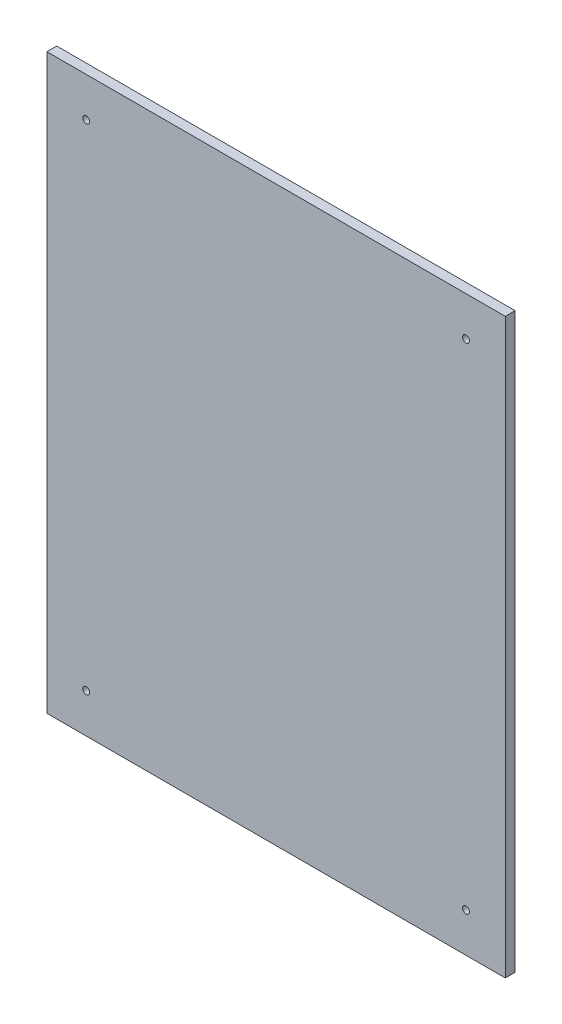
ISO-10303-21;
HEADER;
FILE_DESCRIPTION(('STEP AP214'),'2;1');
FILE_NAME('part.step','',(''),(''),'','','');
FILE_SCHEMA(('AUTOMOTIVE_DESIGN { 1 0 10303 214 1 1 1 1 }'));
ENDSEC;
DATA;
#1=APPLICATION_CONTEXT('core data for automotive mechanical design processes');
#2=APPLICATION_PROTOCOL_DEFINITION('international standard','automotive_design',2000,#1);
#3=PRODUCT_CONTEXT('',#1,'mechanical');
#4=PRODUCT('Part','Part','',(#3));
#5=PRODUCT_RELATED_PRODUCT_CATEGORY('part','',(#4));
#6=PRODUCT_DEFINITION_FORMATION('','',#4);
#7=PRODUCT_DEFINITION_CONTEXT('part definition',#1,'design');
#8=PRODUCT_DEFINITION('design','',#6,#7);
#9=PRODUCT_DEFINITION_SHAPE('','',#8);
#10=(LENGTH_UNIT() NAMED_UNIT(*) SI_UNIT(.MILLI.,.METRE.));
#11=(NAMED_UNIT(*) PLANE_ANGLE_UNIT() SI_UNIT($,.RADIAN.));
#12=(NAMED_UNIT(*) SI_UNIT($,.STERADIAN.) SOLID_ANGLE_UNIT());
#13=UNCERTAINTY_MEASURE_WITH_UNIT(LENGTH_MEASURE(1.E-05),#10,'distance_accuracy_value','');
#14=(GEOMETRIC_REPRESENTATION_CONTEXT(3) GLOBAL_UNCERTAINTY_ASSIGNED_CONTEXT((#13)) GLOBAL_UNIT_ASSIGNED_CONTEXT((#10,
#11,#12)) REPRESENTATION_CONTEXT('',''));
#15=CARTESIAN_POINT('',(0.,0.,0.));
#16=DIRECTION('',(0.,0.,1.));
#17=DIRECTION('',(1.,0.,0.));
#18=AXIS2_PLACEMENT_3D('',#15,#16,#17);
#19=CARTESIAN_POINT('',(140.,-175.,-1.));
#20=DIRECTION('',(1.,0.,0.));
#21=DIRECTION('',(0.,0.,-1.));
#22=AXIS2_PLACEMENT_3D('',#19,#20,#21);
#23=PLANE('',#22);
#24=DIRECTION('',(0.,1.,0.));
#25=VECTOR('',#24,1.);
#26=CARTESIAN_POINT('',(140.,-175.,5.));
#27=LINE('',#26,#25);
#28=CARTESIAN_POINT('',(140.,-175.,5.));
#29=VERTEX_POINT('',#28);
#30=CARTESIAN_POINT('',(140.,175.,5.));
#31=VERTEX_POINT('',#30);
#32=EDGE_CURVE('E104',#29,#31,#27,.T.);
#33=ORIENTED_EDGE('',*,*,#32,.F.);
#34=DIRECTION('',(0.,0.,1.));
#35=VECTOR('',#34,1.);
#36=CARTESIAN_POINT('',(140.,-175.,-1.));
#37=LINE('',#36,#35);
#38=CARTESIAN_POINT('',(140.,-175.,-1.));
#39=VERTEX_POINT('',#38);
#40=EDGE_CURVE('E11',#39,#29,#37,.T.);
#41=ORIENTED_EDGE('',*,*,#40,.F.);
#42=DIRECTION('',(0.,1.,0.));
#43=VECTOR('',#42,1.);
#44=CARTESIAN_POINT('',(140.,-175.,-1.));
#45=LINE('',#44,#43);
#46=CARTESIAN_POINT('',(140.,175.,-1.));
#47=VERTEX_POINT('',#46);
#48=EDGE_CURVE('E97',#39,#47,#45,.T.);
#49=ORIENTED_EDGE('',*,*,#48,.T.);
#50=DIRECTION('',(0.,0.,1.));
#51=VECTOR('',#50,1.);
#52=CARTESIAN_POINT('',(140.,175.,-1.));
#53=LINE('',#52,#51);
#54=EDGE_CURVE('E42',#47,#31,#53,.T.);
#55=ORIENTED_EDGE('',*,*,#54,.T.);
#56=EDGE_LOOP('',(#33,#41,#49,#55));
#57=FACE_BOUND('',#56,.T.);
#58=ADVANCED_FACE('F39',(#57),#23,.T.);
#59=CARTESIAN_POINT('',(-140.,-175.,-1.));
#60=DIRECTION('',(0.,-1.,0.));
#61=DIRECTION('',(0.,0.,-1.));
#62=AXIS2_PLACEMENT_3D('',#59,#60,#61);
#63=PLANE('',#62);
#64=DIRECTION('',(1.,0.,0.));
#65=VECTOR('',#64,1.);
#66=CARTESIAN_POINT('',(-140.,-175.,5.));
#67=LINE('',#66,#65);
#68=CARTESIAN_POINT('',(-140.,-175.,5.));
#69=VERTEX_POINT('',#68);
#70=EDGE_CURVE('E99',#69,#29,#67,.T.);
#71=ORIENTED_EDGE('',*,*,#70,.F.);
#72=DIRECTION('',(0.,0.,1.));
#73=VECTOR('',#72,1.);
#74=CARTESIAN_POINT('',(-140.,-175.,-1.));
#75=LINE('',#74,#73);
#76=CARTESIAN_POINT('',(-140.,-175.,-1.));
#77=VERTEX_POINT('',#76);
#78=EDGE_CURVE('E48',#77,#69,#75,.T.);
#79=ORIENTED_EDGE('',*,*,#78,.F.);
#80=DIRECTION('',(1.,0.,0.));
#81=VECTOR('',#80,1.);
#82=CARTESIAN_POINT('',(-140.,-175.,-1.));
#83=LINE('',#82,#81);
#84=EDGE_CURVE('E94',#77,#39,#83,.T.);
#85=ORIENTED_EDGE('',*,*,#84,.T.);
#86=ORIENTED_EDGE('',*,*,#40,.T.);
#87=EDGE_LOOP('',(#71,#79,#85,#86));
#88=FACE_BOUND('',#87,.T.);
#89=ADVANCED_FACE('F115',(#88),#63,.T.);
#90=CARTESIAN_POINT('',(-140.,-175.,-1.));
#91=DIRECTION('',(-1.,0.,0.));
#92=DIRECTION('',(0.,0.,1.));
#93=AXIS2_PLACEMENT_3D('',#90,#91,#92);
#94=PLANE('',#93);
#95=DIRECTION('',(0.,-1.,0.));
#96=VECTOR('',#95,1.);
#97=CARTESIAN_POINT('',(-140.,-175.,5.));
#98=LINE('',#97,#96);
#99=CARTESIAN_POINT('',(-140.,175.,5.));
#100=VERTEX_POINT('',#99);
#101=EDGE_CURVE('E89',#100,#69,#98,.T.);
#102=ORIENTED_EDGE('',*,*,#101,.F.);
#103=DIRECTION('',(0.,0.,1.));
#104=VECTOR('',#103,1.);
#105=CARTESIAN_POINT('',(-140.,175.,-1.));
#106=LINE('',#105,#104);
#107=CARTESIAN_POINT('',(-140.,175.,-1.));
#108=VERTEX_POINT('',#107);
#109=EDGE_CURVE('E84',#108,#100,#106,.T.);
#110=ORIENTED_EDGE('',*,*,#109,.F.);
#111=DIRECTION('',(0.,-1.,0.));
#112=VECTOR('',#111,1.);
#113=CARTESIAN_POINT('',(-140.,-175.,-1.));
#114=LINE('',#113,#112);
#115=EDGE_CURVE('E87',#108,#77,#114,.T.);
#116=ORIENTED_EDGE('',*,*,#115,.T.);
#117=ORIENTED_EDGE('',*,*,#78,.T.);
#118=EDGE_LOOP('',(#102,#110,#116,#117));
#119=FACE_BOUND('',#118,.T.);
#120=ADVANCED_FACE('F86',(#119),#94,.T.);
#121=CARTESIAN_POINT('',(-140.,175.,-1.));
#122=DIRECTION('',(0.,1.,0.));
#123=DIRECTION('',(0.,0.,1.));
#124=AXIS2_PLACEMENT_3D('',#121,#122,#123);
#125=PLANE('',#124);
#126=DIRECTION('',(-1.,0.,0.));
#127=VECTOR('',#126,1.);
#128=CARTESIAN_POINT('',(-140.,175.,5.));
#129=LINE('',#128,#127);
#130=EDGE_CURVE('E107',#31,#100,#129,.T.);
#131=ORIENTED_EDGE('',*,*,#130,.F.);
#132=ORIENTED_EDGE('',*,*,#54,.F.);
#133=DIRECTION('',(-1.,0.,0.));
#134=VECTOR('',#133,1.);
#135=CARTESIAN_POINT('',(-140.,175.,-1.));
#136=LINE('',#135,#134);
#137=EDGE_CURVE('E93',#47,#108,#136,.T.);
#138=ORIENTED_EDGE('',*,*,#137,.T.);
#139=ORIENTED_EDGE('',*,*,#109,.T.);
#140=EDGE_LOOP('',(#131,#132,#138,#139));
#141=FACE_BOUND('',#140,.T.);
#142=ADVANCED_FACE('F96',(#141),#125,.T.);
#143=CARTESIAN_POINT('',(0.,0.,-1.));
#144=DIRECTION('',(0.,0.,-1.));
#145=DIRECTION('',(-1.,0.,0.));
#146=AXIS2_PLACEMENT_3D('',#143,#144,#145);
#147=PLANE('',#146);
#148=CARTESIAN_POINT('',(115.999999999999,151.,-1.));
#149=DIRECTION('',(0.,0.,-1.));
#150=DIRECTION('',(-1.,0.,0.));
#151=AXIS2_PLACEMENT_3D('',#148,#149,#150);
#152=CIRCLE('',#151,2.1);
#153=CARTESIAN_POINT('',(113.899999999999,151.,-1.));
#154=VERTEX_POINT('',#153);
#155=EDGE_CURVE('E159',#154,#154,#152,.T.);
#156=ORIENTED_EDGE('',*,*,#155,.F.);
#157=EDGE_LOOP('',(#156));
#158=FACE_BOUND('',#157,.T.);
#159=CARTESIAN_POINT('',(115.999999999999,-151.,-1.));
#160=DIRECTION('',(0.,0.,-1.));
#161=DIRECTION('',(-1.,0.,0.));
#162=AXIS2_PLACEMENT_3D('',#159,#160,#161);
#163=CIRCLE('',#162,2.1);
#164=CARTESIAN_POINT('',(113.899999999999,-151.,-1.));
#165=VERTEX_POINT('',#164);
#166=EDGE_CURVE('E161',#165,#165,#163,.T.);
#167=ORIENTED_EDGE('',*,*,#166,.F.);
#168=EDGE_LOOP('',(#167));
#169=FACE_BOUND('',#168,.T.);
#170=CARTESIAN_POINT('',(-116.,-151.,-1.));
#171=DIRECTION('',(0.,0.,-1.));
#172=DIRECTION('',(-1.,0.,0.));
#173=AXIS2_PLACEMENT_3D('',#170,#171,#172);
#174=CIRCLE('',#173,2.1);
#175=CARTESIAN_POINT('',(-118.1,-151.,-1.));
#176=VERTEX_POINT('',#175);
#177=EDGE_CURVE('E169',#176,#176,#174,.T.);
#178=ORIENTED_EDGE('',*,*,#177,.F.);
#179=EDGE_LOOP('',(#178));
#180=FACE_BOUND('',#179,.T.);
#181=CARTESIAN_POINT('',(-116.,151.,-1.));
#182=DIRECTION('',(0.,0.,-1.));
#183=DIRECTION('',(-1.,0.,0.));
#184=AXIS2_PLACEMENT_3D('',#181,#182,#183);
#185=CIRCLE('',#184,2.1);
#186=CARTESIAN_POINT('',(-118.1,151.,-1.));
#187=VERTEX_POINT('',#186);
#188=EDGE_CURVE('E175',#187,#187,#185,.T.);
#189=ORIENTED_EDGE('',*,*,#188,.F.);
#190=EDGE_LOOP('',(#189));
#191=FACE_BOUND('',#190,.T.);
#192=ORIENTED_EDGE('',*,*,#48,.F.);
#193=ORIENTED_EDGE('',*,*,#84,.F.);
#194=ORIENTED_EDGE('',*,*,#115,.F.);
#195=ORIENTED_EDGE('',*,*,#137,.F.);
#196=EDGE_LOOP('',(#192,#193,#194,#195));
#197=FACE_BOUND('',#196,.T.);
#198=ADVANCED_FACE('F92',(#158,#169,#180,#191,#197),#147,.T.);
#199=CARTESIAN_POINT('',(0.,0.,5.));
#200=DIRECTION('',(0.,0.,-1.));
#201=DIRECTION('',(-1.,0.,0.));
#202=AXIS2_PLACEMENT_3D('',#199,#200,#201);
#203=PLANE('',#202);
#204=CARTESIAN_POINT('',(115.999999999999,151.,5.));
#205=DIRECTION('',(0.,0.,-1.));
#206=DIRECTION('',(-1.,0.,0.));
#207=AXIS2_PLACEMENT_3D('',#204,#205,#206);
#208=CIRCLE('',#207,2.1);
#209=CARTESIAN_POINT('',(113.899999999999,151.,5.));
#210=VERTEX_POINT('',#209);
#211=EDGE_CURVE('E157',#210,#210,#208,.T.);
#212=ORIENTED_EDGE('',*,*,#211,.T.);
#213=EDGE_LOOP('',(#212));
#214=FACE_BOUND('',#213,.T.);
#215=CARTESIAN_POINT('',(115.999999999999,-151.,5.));
#216=DIRECTION('',(0.,0.,-1.));
#217=DIRECTION('',(-1.,0.,0.));
#218=AXIS2_PLACEMENT_3D('',#215,#216,#217);
#219=CIRCLE('',#218,2.1);
#220=CARTESIAN_POINT('',(113.899999999999,-151.,5.));
#221=VERTEX_POINT('',#220);
#222=EDGE_CURVE('E166',#221,#221,#219,.T.);
#223=ORIENTED_EDGE('',*,*,#222,.T.);
#224=EDGE_LOOP('',(#223));
#225=FACE_BOUND('',#224,.T.);
#226=CARTESIAN_POINT('',(-116.,-151.,5.));
#227=DIRECTION('',(0.,0.,-1.));
#228=DIRECTION('',(-1.,0.,0.));
#229=AXIS2_PLACEMENT_3D('',#226,#227,#228);
#230=CIRCLE('',#229,2.1);
#231=CARTESIAN_POINT('',(-118.1,-151.,5.));
#232=VERTEX_POINT('',#231);
#233=EDGE_CURVE('E172',#232,#232,#230,.T.);
#234=ORIENTED_EDGE('',*,*,#233,.T.);
#235=EDGE_LOOP('',(#234));
#236=FACE_BOUND('',#235,.T.);
#237=CARTESIAN_POINT('',(-116.,151.,5.));
#238=DIRECTION('',(0.,0.,-1.));
#239=DIRECTION('',(-1.,0.,0.));
#240=AXIS2_PLACEMENT_3D('',#237,#238,#239);
#241=CIRCLE('',#240,2.1);
#242=CARTESIAN_POINT('',(-118.1,151.,5.));
#243=VERTEX_POINT('',#242);
#244=EDGE_CURVE('E108',#243,#243,#241,.T.);
#245=ORIENTED_EDGE('',*,*,#244,.T.);
#246=EDGE_LOOP('',(#245));
#247=FACE_BOUND('',#246,.T.);
#248=ORIENTED_EDGE('',*,*,#32,.T.);
#249=ORIENTED_EDGE('',*,*,#130,.T.);
#250=ORIENTED_EDGE('',*,*,#101,.T.);
#251=ORIENTED_EDGE('',*,*,#70,.T.);
#252=EDGE_LOOP('',(#248,#249,#250,#251));
#253=FACE_BOUND('',#252,.T.);
#254=ADVANCED_FACE('F114',(#214,#225,#236,#247,#253),#203,.F.);
#255=CARTESIAN_POINT('',(-116.,151.,-1.));
#256=DIRECTION('',(0.,0.,-1.));
#257=DIRECTION('',(-1.,0.,0.));
#258=AXIS2_PLACEMENT_3D('',#255,#256,#257);
#259=CYLINDRICAL_SURFACE('',#258,2.1);
#260=ORIENTED_EDGE('',*,*,#244,.F.);
#261=EDGE_LOOP('',(#260));
#262=FACE_BOUND('',#261,.T.);
#263=ORIENTED_EDGE('',*,*,#188,.T.);
#264=EDGE_LOOP('',(#263));
#265=FACE_BOUND('',#264,.T.);
#266=ADVANCED_FACE('F133',(#262,#265),#259,.F.);
#267=CARTESIAN_POINT('',(-116.,-151.,-1.));
#268=DIRECTION('',(0.,0.,-1.));
#269=DIRECTION('',(-1.,0.,0.));
#270=AXIS2_PLACEMENT_3D('',#267,#268,#269);
#271=CYLINDRICAL_SURFACE('',#270,2.1);
#272=ORIENTED_EDGE('',*,*,#233,.F.);
#273=EDGE_LOOP('',(#272));
#274=FACE_BOUND('',#273,.T.);
#275=ORIENTED_EDGE('',*,*,#177,.T.);
#276=EDGE_LOOP('',(#275));
#277=FACE_BOUND('',#276,.T.);
#278=ADVANCED_FACE('F140',(#274,#277),#271,.F.);
#279=CARTESIAN_POINT('',(115.999999999999,-151.,-1.));
#280=DIRECTION('',(0.,0.,-1.));
#281=DIRECTION('',(-1.,0.,0.));
#282=AXIS2_PLACEMENT_3D('',#279,#280,#281);
#283=CYLINDRICAL_SURFACE('',#282,2.1);
#284=ORIENTED_EDGE('',*,*,#222,.F.);
#285=EDGE_LOOP('',(#284));
#286=FACE_BOUND('',#285,.T.);
#287=ORIENTED_EDGE('',*,*,#166,.T.);
#288=EDGE_LOOP('',(#287));
#289=FACE_BOUND('',#288,.T.);
#290=ADVANCED_FACE('F144',(#286,#289),#283,.F.);
#291=CARTESIAN_POINT('',(115.999999999999,151.,-1.));
#292=DIRECTION('',(0.,0.,-1.));
#293=DIRECTION('',(-1.,0.,0.));
#294=AXIS2_PLACEMENT_3D('',#291,#292,#293);
#295=CYLINDRICAL_SURFACE('',#294,2.1);
#296=ORIENTED_EDGE('',*,*,#211,.F.);
#297=EDGE_LOOP('',(#296));
#298=FACE_BOUND('',#297,.T.);
#299=ORIENTED_EDGE('',*,*,#155,.T.);
#300=EDGE_LOOP('',(#299));
#301=FACE_BOUND('',#300,.T.);
#302=ADVANCED_FACE('F148',(#298,#301),#295,.F.);
#303=CLOSED_SHELL('',(#58,#89,#120,#142,#198,#254,#266,#278,#290,#302));
#304=MANIFOLD_SOLID_BREP('B2',#303);
#305=ADVANCED_BREP_SHAPE_REPRESENTATION('',(#18,#304),#14);
#306=SHAPE_DEFINITION_REPRESENTATION(#9,#305);
ENDSEC;
END-ISO-10303-21;
